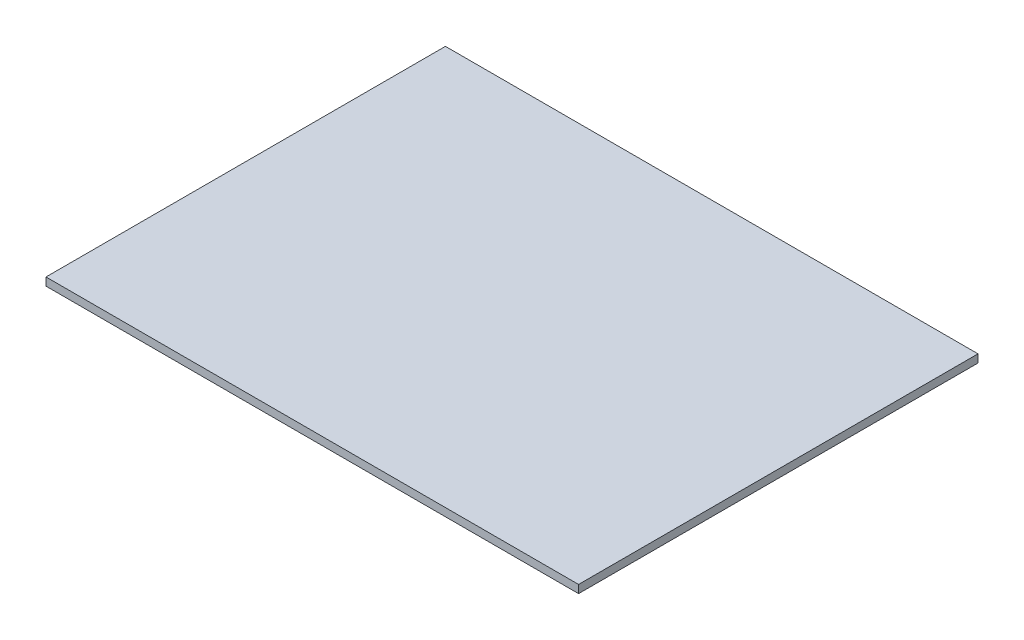
ISO-10303-21;
HEADER;
FILE_DESCRIPTION(('STEP AP214'),'2;1');
FILE_NAME('part.step','',(''),(''),'','','');
FILE_SCHEMA(('AUTOMOTIVE_DESIGN { 1 0 10303 214 1 1 1 1 }'));
ENDSEC;
DATA;
#1=APPLICATION_CONTEXT('core data for automotive mechanical design processes');
#2=APPLICATION_PROTOCOL_DEFINITION('international standard','automotive_design',2000,#1);
#3=PRODUCT_CONTEXT('',#1,'mechanical');
#4=PRODUCT('Part','Part','',(#3));
#5=PRODUCT_RELATED_PRODUCT_CATEGORY('part','',(#4));
#6=PRODUCT_DEFINITION_FORMATION('','',#4);
#7=PRODUCT_DEFINITION_CONTEXT('part definition',#1,'design');
#8=PRODUCT_DEFINITION('design','',#6,#7);
#9=PRODUCT_DEFINITION_SHAPE('','',#8);
#10=(LENGTH_UNIT() NAMED_UNIT(*) SI_UNIT(.MILLI.,.METRE.));
#11=(NAMED_UNIT(*) PLANE_ANGLE_UNIT() SI_UNIT($,.RADIAN.));
#12=(NAMED_UNIT(*) SI_UNIT($,.STERADIAN.) SOLID_ANGLE_UNIT());
#13=UNCERTAINTY_MEASURE_WITH_UNIT(LENGTH_MEASURE(1.E-05),#10,'distance_accuracy_value','');
#14=(GEOMETRIC_REPRESENTATION_CONTEXT(3) GLOBAL_UNCERTAINTY_ASSIGNED_CONTEXT((#13)) GLOBAL_UNIT_ASSIGNED_CONTEXT((#10,
#11,#12)) REPRESENTATION_CONTEXT('',''));
#15=CARTESIAN_POINT('',(0.,0.,0.));
#16=DIRECTION('',(0.,0.,1.));
#17=DIRECTION('',(1.,0.,0.));
#18=AXIS2_PLACEMENT_3D('',#15,#16,#17);
#19=CARTESIAN_POINT('',(0.,3.,0.));
#20=DIRECTION('',(1.,0.,0.));
#21=DIRECTION('',(0.,0.,-1.));
#22=AXIS2_PLACEMENT_3D('',#19,#20,#21);
#23=PLANE('',#22);
#24=DIRECTION('',(0.,0.,1.));
#25=VECTOR('',#24,1.);
#26=CARTESIAN_POINT('',(0.,0.,0.));
#27=LINE('',#26,#25);
#28=CARTESIAN_POINT('',(0.,0.,-150.));
#29=VERTEX_POINT('',#28);
#30=CARTESIAN_POINT('',(0.,0.,0.));
#31=VERTEX_POINT('',#30);
#32=EDGE_CURVE('E104',#29,#31,#27,.T.);
#33=ORIENTED_EDGE('',*,*,#32,.T.);
#34=DIRECTION('',(0.,-1.,0.));
#35=VECTOR('',#34,1.);
#36=CARTESIAN_POINT('',(0.,3.,0.));
#37=LINE('',#36,#35);
#38=CARTESIAN_POINT('',(0.,3.,0.));
#39=VERTEX_POINT('',#38);
#40=EDGE_CURVE('E11',#39,#31,#37,.T.);
#41=ORIENTED_EDGE('',*,*,#40,.F.);
#42=DIRECTION('',(0.,0.,1.));
#43=VECTOR('',#42,1.);
#44=CARTESIAN_POINT('',(0.,3.,0.));
#45=LINE('',#44,#43);
#46=CARTESIAN_POINT('',(0.,3.,-150.));
#47=VERTEX_POINT('',#46);
#48=EDGE_CURVE('E92',#47,#39,#45,.T.);
#49=ORIENTED_EDGE('',*,*,#48,.F.);
#50=DIRECTION('',(0.,-1.,0.));
#51=VECTOR('',#50,1.);
#52=CARTESIAN_POINT('',(0.,3.,-150.));
#53=LINE('',#52,#51);
#54=EDGE_CURVE('E100',#47,#29,#53,.T.);
#55=ORIENTED_EDGE('',*,*,#54,.T.);
#56=EDGE_LOOP('',(#33,#41,#49,#55));
#57=FACE_BOUND('',#56,.T.);
#58=ADVANCED_FACE('F41',(#57),#23,.F.);
#59=CARTESIAN_POINT('',(0.,3.,0.));
#60=DIRECTION('',(0.,0.,-1.));
#61=DIRECTION('',(-1.,0.,0.));
#62=AXIS2_PLACEMENT_3D('',#59,#60,#61);
#63=PLANE('',#62);
#64=DIRECTION('',(1.,0.,0.));
#65=VECTOR('',#64,1.);
#66=CARTESIAN_POINT('',(0.,0.,0.));
#67=LINE('',#66,#65);
#68=CARTESIAN_POINT('',(200.,0.,0.));
#69=VERTEX_POINT('',#68);
#70=EDGE_CURVE('E96',#31,#69,#67,.T.);
#71=ORIENTED_EDGE('',*,*,#70,.T.);
#72=DIRECTION('',(0.,-1.,0.));
#73=VECTOR('',#72,1.);
#74=CARTESIAN_POINT('',(200.,3.,0.));
#75=LINE('',#74,#73);
#76=CARTESIAN_POINT('',(200.,3.,0.));
#77=VERTEX_POINT('',#76);
#78=EDGE_CURVE('E49',#77,#69,#75,.T.);
#79=ORIENTED_EDGE('',*,*,#78,.F.);
#80=DIRECTION('',(1.,0.,0.));
#81=VECTOR('',#80,1.);
#82=CARTESIAN_POINT('',(0.,3.,0.));
#83=LINE('',#82,#81);
#84=EDGE_CURVE('E87',#39,#77,#83,.T.);
#85=ORIENTED_EDGE('',*,*,#84,.F.);
#86=ORIENTED_EDGE('',*,*,#40,.T.);
#87=EDGE_LOOP('',(#71,#79,#85,#86));
#88=FACE_BOUND('',#87,.T.);
#89=ADVANCED_FACE('F95',(#88),#63,.F.);
#90=CARTESIAN_POINT('',(200.,3.,0.));
#91=DIRECTION('',(-1.,0.,0.));
#92=DIRECTION('',(0.,0.,1.));
#93=AXIS2_PLACEMENT_3D('',#90,#91,#92);
#94=PLANE('',#93);
#95=DIRECTION('',(0.,0.,-1.));
#96=VECTOR('',#95,1.);
#97=CARTESIAN_POINT('',(200.,0.,0.));
#98=LINE('',#97,#96);
#99=CARTESIAN_POINT('',(200.,0.,-150.));
#100=VERTEX_POINT('',#99);
#101=EDGE_CURVE('E74',#69,#100,#98,.T.);
#102=ORIENTED_EDGE('',*,*,#101,.T.);
#103=DIRECTION('',(0.,-1.,0.));
#104=VECTOR('',#103,1.);
#105=CARTESIAN_POINT('',(200.,3.,-150.));
#106=LINE('',#105,#104);
#107=CARTESIAN_POINT('',(200.,3.,-150.));
#108=VERTEX_POINT('',#107);
#109=EDGE_CURVE('E97',#108,#100,#106,.T.);
#110=ORIENTED_EDGE('',*,*,#109,.F.);
#111=DIRECTION('',(0.,0.,-1.));
#112=VECTOR('',#111,1.);
#113=CARTESIAN_POINT('',(200.,3.,0.));
#114=LINE('',#113,#112);
#115=EDGE_CURVE('E90',#77,#108,#114,.T.);
#116=ORIENTED_EDGE('',*,*,#115,.F.);
#117=ORIENTED_EDGE('',*,*,#78,.T.);
#118=EDGE_LOOP('',(#102,#110,#116,#117));
#119=FACE_BOUND('',#118,.T.);
#120=ADVANCED_FACE('F98',(#119),#94,.F.);
#121=CARTESIAN_POINT('',(0.,3.,-150.));
#122=DIRECTION('',(0.,0.,1.));
#123=DIRECTION('',(1.,0.,0.));
#124=AXIS2_PLACEMENT_3D('',#121,#122,#123);
#125=PLANE('',#124);
#126=DIRECTION('',(-1.,0.,0.));
#127=VECTOR('',#126,1.);
#128=CARTESIAN_POINT('',(0.,0.,-150.));
#129=LINE('',#128,#127);
#130=EDGE_CURVE('E80',#100,#29,#129,.T.);
#131=ORIENTED_EDGE('',*,*,#130,.T.);
#132=ORIENTED_EDGE('',*,*,#54,.F.);
#133=DIRECTION('',(-1.,0.,0.));
#134=VECTOR('',#133,1.);
#135=CARTESIAN_POINT('',(0.,3.,-150.));
#136=LINE('',#135,#134);
#137=EDGE_CURVE('E57',#108,#47,#136,.T.);
#138=ORIENTED_EDGE('',*,*,#137,.F.);
#139=ORIENTED_EDGE('',*,*,#109,.T.);
#140=EDGE_LOOP('',(#131,#132,#138,#139));
#141=FACE_BOUND('',#140,.T.);
#142=ADVANCED_FACE('F111',(#141),#125,.F.);
#143=CARTESIAN_POINT('',(0.,3.,0.));
#144=DIRECTION('',(0.,-1.,0.));
#145=DIRECTION('',(0.,0.,-1.));
#146=AXIS2_PLACEMENT_3D('',#143,#144,#145);
#147=PLANE('',#146);
#148=ORIENTED_EDGE('',*,*,#48,.T.);
#149=ORIENTED_EDGE('',*,*,#84,.T.);
#150=ORIENTED_EDGE('',*,*,#115,.T.);
#151=ORIENTED_EDGE('',*,*,#137,.T.);
#152=EDGE_LOOP('',(#148,#149,#150,#151));
#153=FACE_BOUND('',#152,.T.);
#154=ADVANCED_FACE('F88',(#153),#147,.F.);
#155=CARTESIAN_POINT('',(0.,0.,0.));
#156=DIRECTION('',(0.,-1.,0.));
#157=DIRECTION('',(0.,0.,-1.));
#158=AXIS2_PLACEMENT_3D('',#155,#156,#157);
#159=PLANE('',#158);
#160=ORIENTED_EDGE('',*,*,#32,.F.);
#161=ORIENTED_EDGE('',*,*,#130,.F.);
#162=ORIENTED_EDGE('',*,*,#101,.F.);
#163=ORIENTED_EDGE('',*,*,#70,.F.);
#164=EDGE_LOOP('',(#160,#161,#162,#163));
#165=FACE_BOUND('',#164,.T.);
#166=ADVANCED_FACE('F114',(#165),#159,.T.);
#167=CLOSED_SHELL('',(#58,#89,#120,#142,#154,#166));
#168=MANIFOLD_SOLID_BREP('B2',#167);
#169=ADVANCED_BREP_SHAPE_REPRESENTATION('',(#18,#168),#14);
#170=SHAPE_DEFINITION_REPRESENTATION(#9,#169);
ENDSEC;
END-ISO-10303-21;
